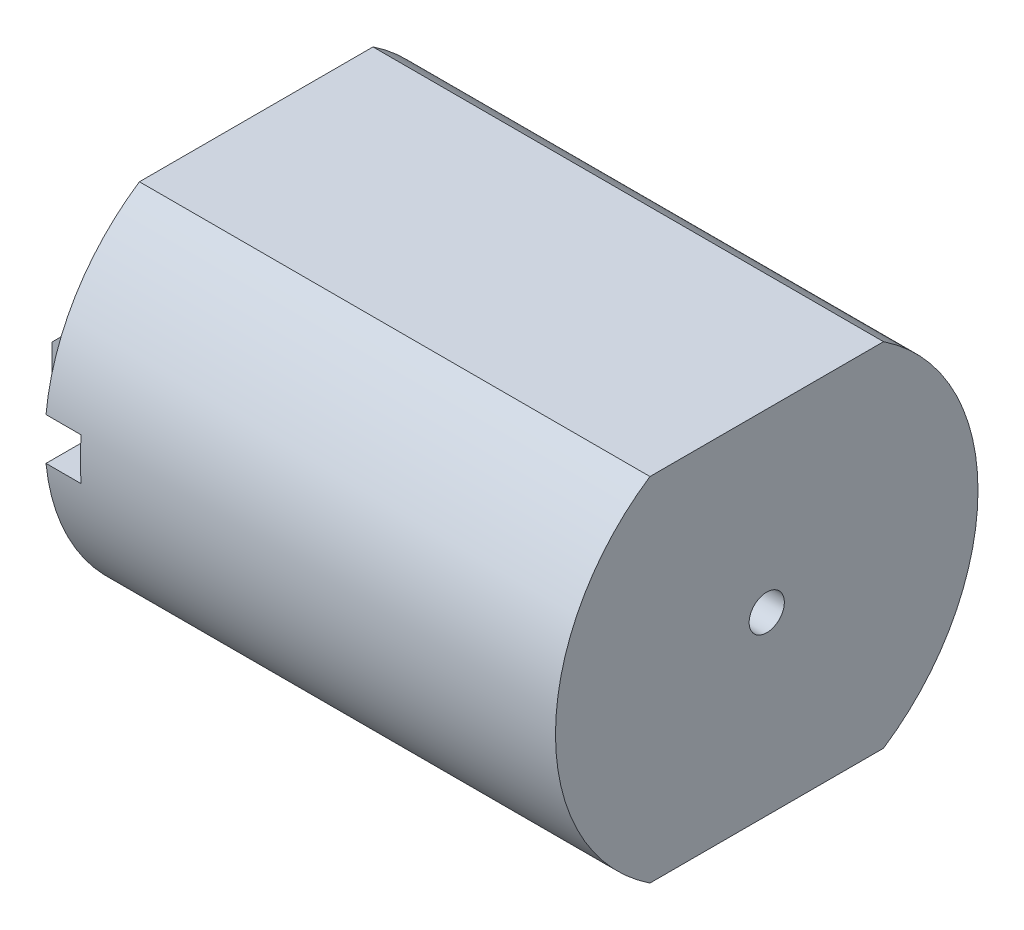
ISO-10303-21;
HEADER;
FILE_DESCRIPTION(('STEP AP214'),'2;1');
FILE_NAME('part.step','',(''),(''),'','','');
FILE_SCHEMA(('AUTOMOTIVE_DESIGN { 1 0 10303 214 1 1 1 1 }'));
ENDSEC;
DATA;
#1=APPLICATION_CONTEXT('core data for automotive mechanical design processes');
#2=APPLICATION_PROTOCOL_DEFINITION('international standard','automotive_design',2000,#1);
#3=PRODUCT_CONTEXT('',#1,'mechanical');
#4=PRODUCT('Part','Part','',(#3));
#5=PRODUCT_RELATED_PRODUCT_CATEGORY('part','',(#4));
#6=PRODUCT_DEFINITION_FORMATION('','',#4);
#7=PRODUCT_DEFINITION_CONTEXT('part definition',#1,'design');
#8=PRODUCT_DEFINITION('design','',#6,#7);
#9=PRODUCT_DEFINITION_SHAPE('','',#8);
#10=(LENGTH_UNIT() NAMED_UNIT(*) SI_UNIT(.MILLI.,.METRE.));
#11=(NAMED_UNIT(*) PLANE_ANGLE_UNIT() SI_UNIT($,.RADIAN.));
#12=(NAMED_UNIT(*) SI_UNIT($,.STERADIAN.) SOLID_ANGLE_UNIT());
#13=UNCERTAINTY_MEASURE_WITH_UNIT(LENGTH_MEASURE(1.E-05),#10,'distance_accuracy_value','');
#14=(GEOMETRIC_REPRESENTATION_CONTEXT(3) GLOBAL_UNCERTAINTY_ASSIGNED_CONTEXT((#13)) GLOBAL_UNIT_ASSIGNED_CONTEXT((#10,
#11,#12)) REPRESENTATION_CONTEXT('',''));
#15=CARTESIAN_POINT('',(0.,0.,0.));
#16=DIRECTION('',(0.,0.,1.));
#17=DIRECTION('',(1.,0.,0.));
#18=AXIS2_PLACEMENT_3D('',#15,#16,#17);
#19=CARTESIAN_POINT('',(-1.,0.,0.));
#20=DIRECTION('',(-1.,0.,0.));
#21=DIRECTION('',(0.,0.,1.));
#22=AXIS2_PLACEMENT_3D('',#19,#20,#21);
#23=PLANE('',#22);
#24=CARTESIAN_POINT('',(-1.,0.,0.));
#25=DIRECTION('',(-1.,0.,0.));
#26=DIRECTION('',(0.,0.,1.));
#27=AXIS2_PLACEMENT_3D('',#24,#25,#26);
#28=CIRCLE('',#27,2.5);
#29=CARTESIAN_POINT('',(-1.,0.,2.5));
#30=VERTEX_POINT('',#29);
#31=EDGE_CURVE('E362',#30,#30,#28,.T.);
#32=ORIENTED_EDGE('',*,*,#31,.F.);
#33=EDGE_LOOP('',(#32));
#34=FACE_BOUND('',#33,.T.);
#35=DIRECTION('',(0.,0.,1.));
#36=VECTOR('',#35,1.);
#37=CARTESIAN_POINT('',(-1.,0.6,-4.96992462263972));
#38=LINE('',#37,#36);
#39=CARTESIAN_POINT('',(-1.,0.600000000000001,-5.96992462263972));
#40=VERTEX_POINT('',#39);
#41=CARTESIAN_POINT('',(-1.,0.6,-4.96992462263972));
#42=VERTEX_POINT('',#41);
#43=EDGE_CURVE('E367',#40,#42,#38,.T.);
#44=ORIENTED_EDGE('',*,*,#43,.T.);
#45=DIRECTION('',(0.,-1.,0.));
#46=VECTOR('',#45,1.);
#47=CARTESIAN_POINT('',(-1.,0.6,-4.96992462263972));
#48=LINE('',#47,#46);
#49=CARTESIAN_POINT('',(-1.,-0.6,-4.96992462263972));
#50=VERTEX_POINT('',#49);
#51=EDGE_CURVE('E371',#42,#50,#48,.T.);
#52=ORIENTED_EDGE('',*,*,#51,.T.);
#53=DIRECTION('',(0.,0.,-1.));
#54=VECTOR('',#53,1.);
#55=CARTESIAN_POINT('',(-1.,-0.6,-4.96992462263972));
#56=LINE('',#55,#54);
#57=CARTESIAN_POINT('',(-1.,-0.6,-5.96992462263972));
#58=VERTEX_POINT('',#57);
#59=EDGE_CURVE('E375',#50,#58,#56,.T.);
#60=ORIENTED_EDGE('',*,*,#59,.T.);
#61=CARTESIAN_POINT('',(-1.,0.,0.));
#62=DIRECTION('',(-1.,0.,0.));
#63=DIRECTION('',(0.,0.,1.));
#64=AXIS2_PLACEMENT_3D('',#61,#62,#63);
#65=CIRCLE('',#64,6.);
#66=CARTESIAN_POINT('',(-1.,-5.,-3.3166247903554));
#67=VERTEX_POINT('',#66);
#68=EDGE_CURVE('E378',#58,#67,#65,.T.);
#69=ORIENTED_EDGE('',*,*,#68,.T.);
#70=DIRECTION('',(0.,0.,1.));
#71=VECTOR('',#70,1.);
#72=CARTESIAN_POINT('',(-1.,-5.,-3.3166247903554));
#73=LINE('',#72,#71);
#74=CARTESIAN_POINT('',(-1.,-5.,3.3166247903554));
#75=VERTEX_POINT('',#74);
#76=EDGE_CURVE('E382',#67,#75,#73,.T.);
#77=ORIENTED_EDGE('',*,*,#76,.T.);
#78=CARTESIAN_POINT('',(-1.,0.,0.));
#79=DIRECTION('',(-1.,0.,0.));
#80=DIRECTION('',(0.,0.,1.));
#81=AXIS2_PLACEMENT_3D('',#78,#79,#80);
#82=CIRCLE('',#81,6.);
#83=CARTESIAN_POINT('',(-1.,-0.600000000000001,5.96992462263972));
#84=VERTEX_POINT('',#83);
#85=EDGE_CURVE('E386',#75,#84,#82,.T.);
#86=ORIENTED_EDGE('',*,*,#85,.T.);
#87=DIRECTION('',(0.,0.,-1.));
#88=VECTOR('',#87,1.);
#89=CARTESIAN_POINT('',(-1.,-0.6,4.96992462263972));
#90=LINE('',#89,#88);
#91=CARTESIAN_POINT('',(-1.,-0.6,4.96992462263972));
#92=VERTEX_POINT('',#91);
#93=EDGE_CURVE('E389',#84,#92,#90,.T.);
#94=ORIENTED_EDGE('',*,*,#93,.T.);
#95=DIRECTION('',(0.,1.,0.));
#96=VECTOR('',#95,1.);
#97=CARTESIAN_POINT('',(-1.,0.6,4.96992462263972));
#98=LINE('',#97,#96);
#99=CARTESIAN_POINT('',(-1.,0.6,4.96992462263972));
#100=VERTEX_POINT('',#99);
#101=EDGE_CURVE('E392',#92,#100,#98,.T.);
#102=ORIENTED_EDGE('',*,*,#101,.T.);
#103=DIRECTION('',(0.,0.,1.));
#104=VECTOR('',#103,1.);
#105=CARTESIAN_POINT('',(-1.,0.6,4.96992462263972));
#106=LINE('',#105,#104);
#107=CARTESIAN_POINT('',(-1.,0.6,5.96992462263972));
#108=VERTEX_POINT('',#107);
#109=EDGE_CURVE('E395',#100,#108,#106,.T.);
#110=ORIENTED_EDGE('',*,*,#109,.T.);
#111=CARTESIAN_POINT('',(-1.,0.,0.));
#112=DIRECTION('',(-1.,0.,0.));
#113=DIRECTION('',(0.,0.,1.));
#114=AXIS2_PLACEMENT_3D('',#111,#112,#113);
#115=CIRCLE('',#114,6.);
#116=CARTESIAN_POINT('',(-1.,5.,3.3166247903554));
#117=VERTEX_POINT('',#116);
#118=EDGE_CURVE('E398',#108,#117,#115,.T.);
#119=ORIENTED_EDGE('',*,*,#118,.T.);
#120=DIRECTION('',(0.,0.,-1.));
#121=VECTOR('',#120,1.);
#122=CARTESIAN_POINT('',(-1.,5.,3.3166247903554));
#123=LINE('',#122,#121);
#124=CARTESIAN_POINT('',(-1.,5.,-3.3166247903554));
#125=VERTEX_POINT('',#124);
#126=EDGE_CURVE('E402',#117,#125,#123,.T.);
#127=ORIENTED_EDGE('',*,*,#126,.T.);
#128=CARTESIAN_POINT('',(-1.,0.,0.));
#129=DIRECTION('',(-1.,0.,0.));
#130=DIRECTION('',(0.,0.,1.));
#131=AXIS2_PLACEMENT_3D('',#128,#129,#130);
#132=CIRCLE('',#131,6.);
#133=EDGE_CURVE('E406',#125,#40,#132,.T.);
#134=ORIENTED_EDGE('',*,*,#133,.T.);
#135=EDGE_LOOP('',(#44,#52,#60,#69,#77,#86,#94,#102,#110,#119,#127,#134));
#136=FACE_BOUND('',#135,.T.);
#137=DIRECTION('',(0.,0.,1.));
#138=VECTOR('',#137,1.);
#139=CARTESIAN_POINT('',(-1.,-0.75,3.75));
#140=LINE('',#139,#138);
#141=CARTESIAN_POINT('',(-1.,-0.75,3.75));
#142=VERTEX_POINT('',#141);
#143=CARTESIAN_POINT('',(-1.,-0.75,4.));
#144=VERTEX_POINT('',#143);
#145=EDGE_CURVE('E336',#142,#144,#140,.T.);
#146=ORIENTED_EDGE('',*,*,#145,.F.);
#147=DIRECTION('',(0.,1.,0.));
#148=VECTOR('',#147,1.);
#149=CARTESIAN_POINT('',(-1.,0.75,3.75));
#150=LINE('',#149,#148);
#151=CARTESIAN_POINT('',(-1.,0.75,3.75));
#152=VERTEX_POINT('',#151);
#153=EDGE_CURVE('E289',#142,#152,#150,.T.);
#154=ORIENTED_EDGE('',*,*,#153,.T.);
#155=DIRECTION('',(0.,0.,1.));
#156=VECTOR('',#155,1.);
#157=CARTESIAN_POINT('',(-1.,0.75,3.75));
#158=LINE('',#157,#156);
#159=CARTESIAN_POINT('',(-1.,0.75,4.));
#160=VERTEX_POINT('',#159);
#161=EDGE_CURVE('E313',#152,#160,#158,.T.);
#162=ORIENTED_EDGE('',*,*,#161,.T.);
#163=DIRECTION('',(0.,1.,0.));
#164=VECTOR('',#163,1.);
#165=CARTESIAN_POINT('',(-1.,0.75,4.));
#166=LINE('',#165,#164);
#167=EDGE_CURVE('E285',#144,#160,#166,.T.);
#168=ORIENTED_EDGE('',*,*,#167,.F.);
#169=EDGE_LOOP('',(#146,#154,#162,#168));
#170=FACE_BOUND('',#169,.T.);
#171=DIRECTION('',(0.,0.,1.));
#172=VECTOR('',#171,1.);
#173=CARTESIAN_POINT('',(-1.,-0.750000000000001,-4.25));
#174=LINE('',#173,#172);
#175=CARTESIAN_POINT('',(-1.,-0.750000000000001,-4.25));
#176=VERTEX_POINT('',#175);
#177=CARTESIAN_POINT('',(-1.,-0.750000000000001,-4.));
#178=VERTEX_POINT('',#177);
#179=EDGE_CURVE('E61',#176,#178,#174,.T.);
#180=ORIENTED_EDGE('',*,*,#179,.F.);
#181=DIRECTION('',(0.,1.,0.));
#182=VECTOR('',#181,1.);
#183=CARTESIAN_POINT('',(-1.,0.749999999999999,-4.25));
#184=LINE('',#183,#182);
#185=CARTESIAN_POINT('',(-1.,0.749999999999999,-4.25));
#186=VERTEX_POINT('',#185);
#187=EDGE_CURVE('E65',#176,#186,#184,.T.);
#188=ORIENTED_EDGE('',*,*,#187,.T.);
#189=DIRECTION('',(0.,0.,1.));
#190=VECTOR('',#189,1.);
#191=CARTESIAN_POINT('',(-1.,0.749999999999999,-4.25));
#192=LINE('',#191,#190);
#193=CARTESIAN_POINT('',(-1.,0.749999999999999,-4.));
#194=VERTEX_POINT('',#193);
#195=EDGE_CURVE('E217',#186,#194,#192,.T.);
#196=ORIENTED_EDGE('',*,*,#195,.T.);
#197=DIRECTION('',(0.,1.,0.));
#198=VECTOR('',#197,1.);
#199=CARTESIAN_POINT('',(-1.,0.749999999999999,-4.));
#200=LINE('',#199,#198);
#201=EDGE_CURVE('E247',#178,#194,#200,.T.);
#202=ORIENTED_EDGE('',*,*,#201,.F.);
#203=EDGE_LOOP('',(#180,#188,#196,#202));
#204=FACE_BOUND('',#203,.T.);
#205=ADVANCED_FACE('F45',(#34,#136,#170,#204),#23,.T.);
#206=CARTESIAN_POINT('',(0.,0.,0.));
#207=DIRECTION('',(1.,0.,0.));
#208=DIRECTION('',(0.,0.,-1.));
#209=AXIS2_PLACEMENT_3D('',#206,#207,#208);
#210=PLANE('',#209);
#211=DIRECTION('',(0.,0.,1.));
#212=VECTOR('',#211,1.);
#213=CARTESIAN_POINT('',(0.,0.6,4.96992462263972));
#214=LINE('',#213,#212);
#215=CARTESIAN_POINT('',(0.,0.6,4.96992462263972));
#216=VERTEX_POINT('',#215);
#217=CARTESIAN_POINT('',(0.,0.6,5.96992462263972));
#218=VERTEX_POINT('',#217);
#219=EDGE_CURVE('E372',#216,#218,#214,.T.);
#220=ORIENTED_EDGE('',*,*,#219,.F.);
#221=DIRECTION('',(0.,1.,0.));
#222=VECTOR('',#221,1.);
#223=CARTESIAN_POINT('',(0.,0.6,4.96992462263972));
#224=LINE('',#223,#222);
#225=CARTESIAN_POINT('',(0.,-0.6,4.96992462263972));
#226=VERTEX_POINT('',#225);
#227=EDGE_CURVE('E425',#226,#216,#224,.T.);
#228=ORIENTED_EDGE('',*,*,#227,.F.);
#229=DIRECTION('',(0.,0.,-1.));
#230=VECTOR('',#229,1.);
#231=CARTESIAN_POINT('',(0.,-0.6,4.96992462263972));
#232=LINE('',#231,#230);
#233=CARTESIAN_POINT('',(0.,-0.6,5.96992462263972));
#234=VERTEX_POINT('',#233);
#235=EDGE_CURVE('E421',#234,#226,#232,.T.);
#236=ORIENTED_EDGE('',*,*,#235,.F.);
#237=CARTESIAN_POINT('',(0.,0.,0.));
#238=DIRECTION('',(1.,0.,0.));
#239=DIRECTION('',(0.,0.,-1.));
#240=AXIS2_PLACEMENT_3D('',#237,#238,#239);
#241=CIRCLE('',#240,6.);
#242=EDGE_CURVE('E469',#218,#234,#241,.T.);
#243=ORIENTED_EDGE('',*,*,#242,.F.);
#244=EDGE_LOOP('',(#220,#228,#236,#243));
#245=FACE_BOUND('',#244,.T.);
#246=ADVANCED_FACE('F519',(#245),#210,.F.);
#247=DIRECTION('',(0.,0.,1.));
#248=VECTOR('',#247,1.);
#249=CARTESIAN_POINT('',(0.,0.6,-4.96992462263972));
#250=LINE('',#249,#248);
#251=CARTESIAN_POINT('',(0.,0.6,-5.96992462263972));
#252=VERTEX_POINT('',#251);
#253=CARTESIAN_POINT('',(0.,0.6,-4.96992462263972));
#254=VERTEX_POINT('',#253);
#255=EDGE_CURVE('E366',#252,#254,#250,.T.);
#256=ORIENTED_EDGE('',*,*,#255,.F.);
#257=CARTESIAN_POINT('',(0.,0.,0.));
#258=DIRECTION('',(1.,0.,0.));
#259=DIRECTION('',(0.,0.,-1.));
#260=AXIS2_PLACEMENT_3D('',#257,#258,#259);
#261=CIRCLE('',#260,6.);
#262=CARTESIAN_POINT('',(0.,-0.6,-5.96992462263972));
#263=VERTEX_POINT('',#262);
#264=EDGE_CURVE('E463',#263,#252,#261,.T.);
#265=ORIENTED_EDGE('',*,*,#264,.F.);
#266=DIRECTION('',(0.,0.,-1.));
#267=VECTOR('',#266,1.);
#268=CARTESIAN_POINT('',(0.,-0.6,-4.96992462263972));
#269=LINE('',#268,#267);
#270=CARTESIAN_POINT('',(0.,-0.6,-4.96992462263972));
#271=VERTEX_POINT('',#270);
#272=EDGE_CURVE('E417',#271,#263,#269,.T.);
#273=ORIENTED_EDGE('',*,*,#272,.F.);
#274=DIRECTION('',(0.,-1.,0.));
#275=VECTOR('',#274,1.);
#276=CARTESIAN_POINT('',(0.,0.6,-4.96992462263972));
#277=LINE('',#276,#275);
#278=EDGE_CURVE('E413',#254,#271,#277,.T.);
#279=ORIENTED_EDGE('',*,*,#278,.F.);
#280=EDGE_LOOP('',(#256,#265,#273,#279));
#281=FACE_BOUND('',#280,.T.);
#282=ADVANCED_FACE('F526',(#281),#210,.F.);
#283=CARTESIAN_POINT('',(13.5,0.,0.));
#284=DIRECTION('',(-1.,0.,0.));
#285=DIRECTION('',(0.,0.,1.));
#286=AXIS2_PLACEMENT_3D('',#283,#284,#285);
#287=CYLINDRICAL_SURFACE('',#286,6.);
#288=DIRECTION('',(-1.,0.,0.));
#289=VECTOR('',#288,1.);
#290=CARTESIAN_POINT('',(13.5,-5.,-3.3166247903554));
#291=LINE('',#290,#289);
#292=CARTESIAN_POINT('',(13.5,-5.,-3.3166247903554));
#293=VERTEX_POINT('',#292);
#294=EDGE_CURVE('E478',#293,#67,#291,.T.);
#295=ORIENTED_EDGE('',*,*,#294,.T.);
#296=ORIENTED_EDGE('',*,*,#68,.F.);
#297=DIRECTION('',(1.,0.,0.));
#298=VECTOR('',#297,1.);
#299=CARTESIAN_POINT('',(-1.,-0.6,-5.96992462263972));
#300=LINE('',#299,#298);
#301=EDGE_CURVE('E451',#58,#263,#300,.T.);
#302=ORIENTED_EDGE('',*,*,#301,.T.);
#303=ORIENTED_EDGE('',*,*,#264,.T.);
#304=DIRECTION('',(1.,0.,0.));
#305=VECTOR('',#304,1.);
#306=CARTESIAN_POINT('',(-1.,0.600000000000001,-5.96992462263972));
#307=LINE('',#306,#305);
#308=EDGE_CURVE('E409',#40,#252,#307,.T.);
#309=ORIENTED_EDGE('',*,*,#308,.F.);
#310=ORIENTED_EDGE('',*,*,#133,.F.);
#311=DIRECTION('',(-1.,0.,0.));
#312=VECTOR('',#311,1.);
#313=CARTESIAN_POINT('',(13.5,5.,-3.3166247903554));
#314=LINE('',#313,#312);
#315=CARTESIAN_POINT('',(13.5,5.,-3.3166247903554));
#316=VERTEX_POINT('',#315);
#317=EDGE_CURVE('E493',#316,#125,#314,.T.);
#318=ORIENTED_EDGE('',*,*,#317,.F.);
#319=CARTESIAN_POINT('',(13.5,0.,0.));
#320=DIRECTION('',(1.,0.,0.));
#321=DIRECTION('',(0.,0.,-1.));
#322=AXIS2_PLACEMENT_3D('',#319,#320,#321);
#323=CIRCLE('',#322,6.);
#324=EDGE_CURVE('E464',#293,#316,#323,.T.);
#325=ORIENTED_EDGE('',*,*,#324,.F.);
#326=EDGE_LOOP('',(#295,#296,#302,#303,#309,#310,#318,#325));
#327=FACE_BOUND('',#326,.T.);
#328=ADVANCED_FACE('F572',(#327),#287,.T.);
#329=CARTESIAN_POINT('',(13.5,5.,3.3166247903554));
#330=DIRECTION('',(0.,-1.,0.));
#331=DIRECTION('',(0.,0.,-1.));
#332=AXIS2_PLACEMENT_3D('',#329,#330,#331);
#333=PLANE('',#332);
#334=ORIENTED_EDGE('',*,*,#317,.T.);
#335=ORIENTED_EDGE('',*,*,#126,.F.);
#336=DIRECTION('',(-1.,0.,0.));
#337=VECTOR('',#336,1.);
#338=CARTESIAN_POINT('',(13.5,5.,3.3166247903554));
#339=LINE('',#338,#337);
#340=CARTESIAN_POINT('',(13.5,5.,3.3166247903554));
#341=VERTEX_POINT('',#340);
#342=EDGE_CURVE('E490',#341,#117,#339,.T.);
#343=ORIENTED_EDGE('',*,*,#342,.F.);
#344=DIRECTION('',(0.,0.,1.));
#345=VECTOR('',#344,1.);
#346=CARTESIAN_POINT('',(13.5,5.,3.3166247903554));
#347=LINE('',#346,#345);
#348=EDGE_CURVE('E468',#316,#341,#347,.T.);
#349=ORIENTED_EDGE('',*,*,#348,.F.);
#350=EDGE_LOOP('',(#334,#335,#343,#349));
#351=FACE_BOUND('',#350,.T.);
#352=ADVANCED_FACE('F569',(#351),#333,.F.);
#353=CARTESIAN_POINT('',(13.5,0.,0.));
#354=DIRECTION('',(-1.,0.,0.));
#355=DIRECTION('',(0.,0.,1.));
#356=AXIS2_PLACEMENT_3D('',#353,#354,#355);
#357=CYLINDRICAL_SURFACE('',#356,6.);
#358=ORIENTED_EDGE('',*,*,#342,.T.);
#359=ORIENTED_EDGE('',*,*,#118,.F.);
#360=DIRECTION('',(1.,0.,0.));
#361=VECTOR('',#360,1.);
#362=CARTESIAN_POINT('',(-1.,0.6,5.96992462263972));
#363=LINE('',#362,#361);
#364=EDGE_CURVE('E435',#108,#218,#363,.T.);
#365=ORIENTED_EDGE('',*,*,#364,.T.);
#366=ORIENTED_EDGE('',*,*,#242,.T.);
#367=DIRECTION('',(1.,0.,0.));
#368=VECTOR('',#367,1.);
#369=CARTESIAN_POINT('',(-1.,-0.600000000000001,5.96992462263972));
#370=LINE('',#369,#368);
#371=EDGE_CURVE('E447',#84,#234,#370,.T.);
#372=ORIENTED_EDGE('',*,*,#371,.F.);
#373=ORIENTED_EDGE('',*,*,#85,.F.);
#374=DIRECTION('',(-1.,0.,0.));
#375=VECTOR('',#374,1.);
#376=CARTESIAN_POINT('',(13.5,-5.,3.3166247903554));
#377=LINE('',#376,#375);
#378=CARTESIAN_POINT('',(13.5,-5.,3.3166247903554));
#379=VERTEX_POINT('',#378);
#380=EDGE_CURVE('E487',#379,#75,#377,.T.);
#381=ORIENTED_EDGE('',*,*,#380,.F.);
#382=CARTESIAN_POINT('',(13.5,0.,0.));
#383=DIRECTION('',(1.,0.,0.));
#384=DIRECTION('',(0.,0.,-1.));
#385=AXIS2_PLACEMENT_3D('',#382,#383,#384);
#386=CIRCLE('',#385,6.);
#387=EDGE_CURVE('E472',#341,#379,#386,.T.);
#388=ORIENTED_EDGE('',*,*,#387,.F.);
#389=EDGE_LOOP('',(#358,#359,#365,#366,#372,#373,#381,#388));
#390=FACE_BOUND('',#389,.T.);
#391=ADVANCED_FACE('F565',(#390),#357,.T.);
#392=CARTESIAN_POINT('',(13.5,-5.,3.3166247903554));
#393=DIRECTION('',(0.,1.,0.));
#394=DIRECTION('',(0.,0.,1.));
#395=AXIS2_PLACEMENT_3D('',#392,#393,#394);
#396=PLANE('',#395);
#397=ORIENTED_EDGE('',*,*,#380,.T.);
#398=ORIENTED_EDGE('',*,*,#76,.F.);
#399=ORIENTED_EDGE('',*,*,#294,.F.);
#400=DIRECTION('',(0.,0.,-1.));
#401=VECTOR('',#400,1.);
#402=CARTESIAN_POINT('',(13.5,-5.,3.3166247903554));
#403=LINE('',#402,#401);
#404=EDGE_CURVE('E475',#379,#293,#403,.T.);
#405=ORIENTED_EDGE('',*,*,#404,.F.);
#406=EDGE_LOOP('',(#397,#398,#399,#405));
#407=FACE_BOUND('',#406,.T.);
#408=ADVANCED_FACE('F560',(#407),#396,.F.);
#409=CARTESIAN_POINT('',(13.5,0.,0.));
#410=DIRECTION('',(1.,0.,0.));
#411=DIRECTION('',(0.,0.,-1.));
#412=AXIS2_PLACEMENT_3D('',#409,#410,#411);
#413=PLANE('',#412);
#414=CARTESIAN_POINT('',(13.5,0.,0.));
#415=DIRECTION('',(1.,0.,0.));
#416=DIRECTION('',(0.,0.,-1.));
#417=AXIS2_PLACEMENT_3D('',#414,#415,#416);
#418=CIRCLE('',#417,0.5);
#419=CARTESIAN_POINT('',(13.5,0.,-0.5));
#420=VERTEX_POINT('',#419);
#421=EDGE_CURVE('E340',#420,#420,#418,.F.);
#422=ORIENTED_EDGE('',*,*,#421,.T.);
#423=EDGE_LOOP('',(#422));
#424=FACE_BOUND('',#423,.T.);
#425=ORIENTED_EDGE('',*,*,#324,.T.);
#426=ORIENTED_EDGE('',*,*,#348,.T.);
#427=ORIENTED_EDGE('',*,*,#387,.T.);
#428=ORIENTED_EDGE('',*,*,#404,.T.);
#429=EDGE_LOOP('',(#425,#426,#427,#428));
#430=FACE_BOUND('',#429,.T.);
#431=ADVANCED_FACE('F557',(#424,#430),#413,.T.);
#432=CARTESIAN_POINT('',(-1.,0.6,-4.96992462263972));
#433=DIRECTION('',(0.,1.,0.));
#434=DIRECTION('',(0.,0.,1.));
#435=AXIS2_PLACEMENT_3D('',#432,#433,#434);
#436=PLANE('',#435);
#437=ORIENTED_EDGE('',*,*,#255,.T.);
#438=DIRECTION('',(1.,0.,0.));
#439=VECTOR('',#438,1.);
#440=CARTESIAN_POINT('',(-1.,0.6,-4.96992462263972));
#441=LINE('',#440,#439);
#442=EDGE_CURVE('E459',#42,#254,#441,.T.);
#443=ORIENTED_EDGE('',*,*,#442,.F.);
#444=ORIENTED_EDGE('',*,*,#43,.F.);
#445=ORIENTED_EDGE('',*,*,#308,.T.);
#446=EDGE_LOOP('',(#437,#443,#444,#445));
#447=FACE_BOUND('',#446,.T.);
#448=ADVANCED_FACE('F553',(#447),#436,.F.);
#449=CARTESIAN_POINT('',(-1.,0.6,-4.96992462263972));
#450=DIRECTION('',(0.,0.,1.));
#451=DIRECTION('',(1.,0.,0.));
#452=AXIS2_PLACEMENT_3D('',#449,#450,#451);
#453=PLANE('',#452);
#454=ORIENTED_EDGE('',*,*,#278,.T.);
#455=DIRECTION('',(1.,0.,0.));
#456=VECTOR('',#455,1.);
#457=CARTESIAN_POINT('',(-1.,-0.6,-4.96992462263972));
#458=LINE('',#457,#456);
#459=EDGE_CURVE('E455',#50,#271,#458,.T.);
#460=ORIENTED_EDGE('',*,*,#459,.F.);
#461=ORIENTED_EDGE('',*,*,#51,.F.);
#462=ORIENTED_EDGE('',*,*,#442,.T.);
#463=EDGE_LOOP('',(#454,#460,#461,#462));
#464=FACE_BOUND('',#463,.T.);
#465=ADVANCED_FACE('F549',(#464),#453,.F.);
#466=CARTESIAN_POINT('',(-1.,-0.6,-4.96992462263972));
#467=DIRECTION('',(0.,-1.,0.));
#468=DIRECTION('',(0.,0.,-1.));
#469=AXIS2_PLACEMENT_3D('',#466,#467,#468);
#470=PLANE('',#469);
#471=ORIENTED_EDGE('',*,*,#272,.T.);
#472=ORIENTED_EDGE('',*,*,#301,.F.);
#473=ORIENTED_EDGE('',*,*,#59,.F.);
#474=ORIENTED_EDGE('',*,*,#459,.T.);
#475=EDGE_LOOP('',(#471,#472,#473,#474));
#476=FACE_BOUND('',#475,.T.);
#477=ADVANCED_FACE('F545',(#476),#470,.F.);
#478=CARTESIAN_POINT('',(-1.,-0.6,4.96992462263972));
#479=DIRECTION('',(0.,-1.,0.));
#480=DIRECTION('',(0.,0.,-1.));
#481=AXIS2_PLACEMENT_3D('',#478,#479,#480);
#482=PLANE('',#481);
#483=ORIENTED_EDGE('',*,*,#235,.T.);
#484=DIRECTION('',(1.,0.,0.));
#485=VECTOR('',#484,1.);
#486=CARTESIAN_POINT('',(-1.,-0.6,4.96992462263972));
#487=LINE('',#486,#485);
#488=EDGE_CURVE('E443',#92,#226,#487,.T.);
#489=ORIENTED_EDGE('',*,*,#488,.F.);
#490=ORIENTED_EDGE('',*,*,#93,.F.);
#491=ORIENTED_EDGE('',*,*,#371,.T.);
#492=EDGE_LOOP('',(#483,#489,#490,#491));
#493=FACE_BOUND('',#492,.T.);
#494=ADVANCED_FACE('F541',(#493),#482,.F.);
#495=CARTESIAN_POINT('',(-1.,0.6,4.96992462263972));
#496=DIRECTION('',(0.,0.,-1.));
#497=DIRECTION('',(-1.,0.,0.));
#498=AXIS2_PLACEMENT_3D('',#495,#496,#497);
#499=PLANE('',#498);
#500=ORIENTED_EDGE('',*,*,#227,.T.);
#501=DIRECTION('',(1.,0.,0.));
#502=VECTOR('',#501,1.);
#503=CARTESIAN_POINT('',(-1.,0.6,4.96992462263972));
#504=LINE('',#503,#502);
#505=EDGE_CURVE('E439',#100,#216,#504,.T.);
#506=ORIENTED_EDGE('',*,*,#505,.F.);
#507=ORIENTED_EDGE('',*,*,#101,.F.);
#508=ORIENTED_EDGE('',*,*,#488,.T.);
#509=EDGE_LOOP('',(#500,#506,#507,#508));
#510=FACE_BOUND('',#509,.T.);
#511=ADVANCED_FACE('F537',(#510),#499,.F.);
#512=CARTESIAN_POINT('',(-1.,0.6,4.96992462263972));
#513=DIRECTION('',(0.,1.,0.));
#514=DIRECTION('',(0.,0.,1.));
#515=AXIS2_PLACEMENT_3D('',#512,#513,#514);
#516=PLANE('',#515);
#517=ORIENTED_EDGE('',*,*,#219,.T.);
#518=ORIENTED_EDGE('',*,*,#364,.F.);
#519=ORIENTED_EDGE('',*,*,#109,.F.);
#520=ORIENTED_EDGE('',*,*,#505,.T.);
#521=EDGE_LOOP('',(#517,#518,#519,#520));
#522=FACE_BOUND('',#521,.T.);
#523=ADVANCED_FACE('F534',(#522),#516,.F.);
#524=CARTESIAN_POINT('',(-2.,0.,0.));
#525=DIRECTION('',(-1.,0.,0.));
#526=DIRECTION('',(0.,0.,1.));
#527=AXIS2_PLACEMENT_3D('',#524,#525,#526);
#528=PLANE('',#527);
#529=CARTESIAN_POINT('',(-2.,0.,0.));
#530=DIRECTION('',(-1.,0.,0.));
#531=DIRECTION('',(0.,0.,1.));
#532=AXIS2_PLACEMENT_3D('',#529,#530,#531);
#533=CIRCLE('',#532,2.25);
#534=CARTESIAN_POINT('',(-2.,0.,2.25));
#535=VERTEX_POINT('',#534);
#536=EDGE_CURVE('E54',#535,#535,#533,.T.);
#537=ORIENTED_EDGE('',*,*,#536,.T.);
#538=EDGE_LOOP('',(#537));
#539=FACE_BOUND('',#538,.T.);
#540=CARTESIAN_POINT('',(-2.,0.,0.));
#541=DIRECTION('',(-1.,0.,0.));
#542=DIRECTION('',(0.,0.,1.));
#543=AXIS2_PLACEMENT_3D('',#540,#541,#542);
#544=CIRCLE('',#543,0.5);
#545=CARTESIAN_POINT('',(-2.,0.,0.5));
#546=VERTEX_POINT('',#545);
#547=EDGE_CURVE('E358',#546,#546,#544,.T.);
#548=ORIENTED_EDGE('',*,*,#547,.F.);
#549=EDGE_LOOP('',(#548));
#550=FACE_BOUND('',#549,.T.);
#551=ADVANCED_FACE('F499',(#539,#550),#528,.T.);
#552=CARTESIAN_POINT('',(-2.,0.,0.));
#553=DIRECTION('',(1.,0.,0.));
#554=DIRECTION('',(0.,0.,-1.));
#555=AXIS2_PLACEMENT_3D('',#552,#553,#554);
#556=CYLINDRICAL_SURFACE('',#555,2.5);
#557=CARTESIAN_POINT('',(-1.75,0.,0.));
#558=DIRECTION('',(-1.,0.,0.));
#559=DIRECTION('',(0.,0.,1.));
#560=AXIS2_PLACEMENT_3D('',#557,#558,#559);
#561=CIRCLE('',#560,2.5);
#562=CARTESIAN_POINT('',(-1.75,0.,2.5));
#563=VERTEX_POINT('',#562);
#564=EDGE_CURVE('E11',#563,#563,#561,.F.);
#565=ORIENTED_EDGE('',*,*,#564,.T.);
#566=EDGE_LOOP('',(#565));
#567=FACE_BOUND('',#566,.T.);
#568=ORIENTED_EDGE('',*,*,#31,.T.);
#569=EDGE_LOOP('',(#568));
#570=FACE_BOUND('',#569,.T.);
#571=ADVANCED_FACE('F514',(#567,#570),#556,.T.);
#572=CARTESIAN_POINT('',(-2.,0.,0.));
#573=DIRECTION('',(1.,0.,0.));
#574=DIRECTION('',(0.,0.,-1.));
#575=AXIS2_PLACEMENT_3D('',#572,#573,#574);
#576=CYLINDRICAL_SURFACE('',#575,0.5);
#577=ORIENTED_EDGE('',*,*,#547,.T.);
#578=EDGE_LOOP('',(#577));
#579=FACE_BOUND('',#578,.T.);
#580=ORIENTED_EDGE('',*,*,#421,.F.);
#581=EDGE_LOOP('',(#580));
#582=FACE_BOUND('',#581,.T.);
#583=ADVANCED_FACE('F504',(#579,#582),#576,.F.);
#584=CARTESIAN_POINT('',(-1.75,0.,0.));
#585=DIRECTION('',(-1.,0.,0.));
#586=DIRECTION('',(0.,0.,1.));
#587=AXIS2_PLACEMENT_3D('',#584,#585,#586);
#588=TOROIDAL_SURFACE('',#587,2.25,0.25);
#589=ORIENTED_EDGE('',*,*,#564,.F.);
#590=EDGE_LOOP('',(#589));
#591=FACE_BOUND('',#590,.T.);
#592=ORIENTED_EDGE('',*,*,#536,.F.);
#593=EDGE_LOOP('',(#592));
#594=FACE_BOUND('',#593,.T.);
#595=ADVANCED_FACE('F47',(#591,#594),#588,.T.);
#596=CARTESIAN_POINT('',(-2.55,-0.75,3.75));
#597=DIRECTION('',(0.,-1.,0.));
#598=DIRECTION('',(0.,0.,-1.));
#599=AXIS2_PLACEMENT_3D('',#596,#597,#598);
#600=PLANE('',#599);
#601=DIRECTION('',(1.,0.,0.));
#602=VECTOR('',#601,1.);
#603=CARTESIAN_POINT('',(-2.55,-0.75,4.));
#604=LINE('',#603,#602);
#605=CARTESIAN_POINT('',(-2.55,-0.75,4.));
#606=VERTEX_POINT('',#605);
#607=EDGE_CURVE('E293',#606,#144,#604,.T.);
#608=ORIENTED_EDGE('',*,*,#607,.F.);
#609=DIRECTION('',(0.,0.,1.));
#610=VECTOR('',#609,1.);
#611=CARTESIAN_POINT('',(-2.55,-0.75,3.75));
#612=LINE('',#611,#610);
#613=CARTESIAN_POINT('',(-2.55,-0.75,3.75));
#614=VERTEX_POINT('',#613);
#615=EDGE_CURVE('E341',#614,#606,#612,.T.);
#616=ORIENTED_EDGE('',*,*,#615,.F.);
#617=DIRECTION('',(1.,0.,0.));
#618=VECTOR('',#617,1.);
#619=CARTESIAN_POINT('',(-2.55,-0.75,3.75));
#620=LINE('',#619,#618);
#621=EDGE_CURVE('E309',#614,#142,#620,.T.);
#622=ORIENTED_EDGE('',*,*,#621,.T.);
#623=ORIENTED_EDGE('',*,*,#145,.T.);
#624=EDGE_LOOP('',(#608,#616,#622,#623));
#625=FACE_BOUND('',#624,.T.);
#626=ADVANCED_FACE('F503',(#625),#600,.T.);
#627=CARTESIAN_POINT('',(-2.8,-0.5,3.75));
#628=DIRECTION('',(-0.707106781186548,-0.707106781186547,0.));
#629=DIRECTION('',(0.707106781186547,-0.707106781186548,0.));
#630=AXIS2_PLACEMENT_3D('',#627,#628,#629);
#631=PLANE('',#630);
#632=DIRECTION('',(0.707106781186547,-0.707106781186548,0.));
#633=VECTOR('',#632,1.);
#634=CARTESIAN_POINT('',(-2.8,-0.5,4.));
#635=LINE('',#634,#633);
#636=CARTESIAN_POINT('',(-2.8,-0.5,4.));
#637=VERTEX_POINT('',#636);
#638=EDGE_CURVE('E329',#637,#606,#635,.T.);
#639=ORIENTED_EDGE('',*,*,#638,.F.);
#640=DIRECTION('',(0.,0.,1.));
#641=VECTOR('',#640,1.);
#642=CARTESIAN_POINT('',(-2.8,-0.5,3.75));
#643=LINE('',#642,#641);
#644=CARTESIAN_POINT('',(-2.8,-0.5,3.75));
#645=VERTEX_POINT('',#644);
#646=EDGE_CURVE('E344',#645,#637,#643,.T.);
#647=ORIENTED_EDGE('',*,*,#646,.F.);
#648=DIRECTION('',(0.707106781186547,-0.707106781186548,0.));
#649=VECTOR('',#648,1.);
#650=CARTESIAN_POINT('',(-2.8,-0.5,3.75));
#651=LINE('',#650,#649);
#652=EDGE_CURVE('E305',#645,#614,#651,.T.);
#653=ORIENTED_EDGE('',*,*,#652,.T.);
#654=ORIENTED_EDGE('',*,*,#615,.T.);
#655=EDGE_LOOP('',(#639,#647,#653,#654));
#656=FACE_BOUND('',#655,.T.);
#657=ADVANCED_FACE('F511',(#656),#631,.T.);
#658=CARTESIAN_POINT('',(-2.8,0.5,3.75));
#659=DIRECTION('',(-1.,0.,0.));
#660=DIRECTION('',(0.,0.,1.));
#661=AXIS2_PLACEMENT_3D('',#658,#659,#660);
#662=PLANE('',#661);
#663=DIRECTION('',(0.,-1.,0.));
#664=VECTOR('',#663,1.);
#665=CARTESIAN_POINT('',(-2.8,0.5,4.));
#666=LINE('',#665,#664);
#667=CARTESIAN_POINT('',(-2.8,0.5,4.));
#668=VERTEX_POINT('',#667);
#669=EDGE_CURVE('E325',#668,#637,#666,.T.);
#670=ORIENTED_EDGE('',*,*,#669,.F.);
#671=DIRECTION('',(0.,0.,1.));
#672=VECTOR('',#671,1.);
#673=CARTESIAN_POINT('',(-2.8,0.5,3.75));
#674=LINE('',#673,#672);
#675=CARTESIAN_POINT('',(-2.8,0.5,3.75));
#676=VERTEX_POINT('',#675);
#677=EDGE_CURVE('E347',#676,#668,#674,.T.);
#678=ORIENTED_EDGE('',*,*,#677,.F.);
#679=DIRECTION('',(0.,-1.,0.));
#680=VECTOR('',#679,1.);
#681=CARTESIAN_POINT('',(-2.8,0.5,3.75));
#682=LINE('',#681,#680);
#683=EDGE_CURVE('E301',#676,#645,#682,.T.);
#684=ORIENTED_EDGE('',*,*,#683,.T.);
#685=ORIENTED_EDGE('',*,*,#646,.T.);
#686=EDGE_LOOP('',(#670,#678,#684,#685));
#687=FACE_BOUND('',#686,.T.);
#688=ADVANCED_FACE('F622',(#687),#662,.T.);
#689=CARTESIAN_POINT('',(-2.8,0.5,3.75));
#690=DIRECTION('',(-0.707106781186548,0.707106781186547,0.));
#691=DIRECTION('',(-0.707106781186547,-0.707106781186548,0.));
#692=AXIS2_PLACEMENT_3D('',#689,#690,#691);
#693=PLANE('',#692);
#694=DIRECTION('',(-0.707106781186547,-0.707106781186548,0.));
#695=VECTOR('',#694,1.);
#696=CARTESIAN_POINT('',(-2.8,0.5,4.));
#697=LINE('',#696,#695);
#698=CARTESIAN_POINT('',(-2.55,0.75,4.));
#699=VERTEX_POINT('',#698);
#700=EDGE_CURVE('E321',#699,#668,#697,.T.);
#701=ORIENTED_EDGE('',*,*,#700,.F.);
#702=DIRECTION('',(0.,0.,1.));
#703=VECTOR('',#702,1.);
#704=CARTESIAN_POINT('',(-2.55,0.75,3.75));
#705=LINE('',#704,#703);
#706=CARTESIAN_POINT('',(-2.55,0.75,3.75));
#707=VERTEX_POINT('',#706);
#708=EDGE_CURVE('E350',#707,#699,#705,.T.);
#709=ORIENTED_EDGE('',*,*,#708,.F.);
#710=DIRECTION('',(-0.707106781186547,-0.707106781186548,0.));
#711=VECTOR('',#710,1.);
#712=CARTESIAN_POINT('',(-2.8,0.5,3.75));
#713=LINE('',#712,#711);
#714=EDGE_CURVE('E297',#707,#676,#713,.T.);
#715=ORIENTED_EDGE('',*,*,#714,.T.);
#716=ORIENTED_EDGE('',*,*,#677,.T.);
#717=EDGE_LOOP('',(#701,#709,#715,#716));
#718=FACE_BOUND('',#717,.T.);
#719=ADVANCED_FACE('F625',(#718),#693,.T.);
#720=CARTESIAN_POINT('',(-2.55,0.75,3.75));
#721=DIRECTION('',(0.,1.,0.));
#722=DIRECTION('',(0.,0.,1.));
#723=AXIS2_PLACEMENT_3D('',#720,#721,#722);
#724=PLANE('',#723);
#725=DIRECTION('',(-1.,0.,0.));
#726=VECTOR('',#725,1.);
#727=CARTESIAN_POINT('',(-2.55,0.75,4.));
#728=LINE('',#727,#726);
#729=EDGE_CURVE('E317',#160,#699,#728,.T.);
#730=ORIENTED_EDGE('',*,*,#729,.F.);
#731=ORIENTED_EDGE('',*,*,#161,.F.);
#732=DIRECTION('',(-1.,0.,0.));
#733=VECTOR('',#732,1.);
#734=CARTESIAN_POINT('',(-2.55,0.75,3.75));
#735=LINE('',#734,#733);
#736=EDGE_CURVE('E292',#152,#707,#735,.T.);
#737=ORIENTED_EDGE('',*,*,#736,.T.);
#738=ORIENTED_EDGE('',*,*,#708,.T.);
#739=EDGE_LOOP('',(#730,#731,#737,#738));
#740=FACE_BOUND('',#739,.T.);
#741=ADVANCED_FACE('F628',(#740),#724,.T.);
#742=CARTESIAN_POINT('',(0.,0.,3.75));
#743=DIRECTION('',(0.,0.,1.));
#744=DIRECTION('',(1.,0.,0.));
#745=AXIS2_PLACEMENT_3D('',#742,#743,#744);
#746=PLANE('',#745);
#747=CARTESIAN_POINT('',(-2.15,0.,3.75));
#748=DIRECTION('',(0.,0.,1.));
#749=DIRECTION('',(1.,0.,0.));
#750=AXIS2_PLACEMENT_3D('',#747,#748,#749);
#751=CIRCLE('',#750,0.5);
#752=CARTESIAN_POINT('',(-1.65,0.,3.75));
#753=VERTEX_POINT('',#752);
#754=EDGE_CURVE('E281',#753,#753,#751,.T.);
#755=ORIENTED_EDGE('',*,*,#754,.T.);
#756=EDGE_LOOP('',(#755));
#757=FACE_BOUND('',#756,.T.);
#758=ORIENTED_EDGE('',*,*,#153,.F.);
#759=ORIENTED_EDGE('',*,*,#621,.F.);
#760=ORIENTED_EDGE('',*,*,#652,.F.);
#761=ORIENTED_EDGE('',*,*,#683,.F.);
#762=ORIENTED_EDGE('',*,*,#714,.F.);
#763=ORIENTED_EDGE('',*,*,#736,.F.);
#764=EDGE_LOOP('',(#758,#759,#760,#761,#762,#763));
#765=FACE_BOUND('',#764,.T.);
#766=ADVANCED_FACE('F614',(#757,#765),#746,.F.);
#767=CARTESIAN_POINT('',(0.,0.,4.));
#768=DIRECTION('',(0.,0.,1.));
#769=DIRECTION('',(1.,0.,0.));
#770=AXIS2_PLACEMENT_3D('',#767,#768,#769);
#771=PLANE('',#770);
#772=CARTESIAN_POINT('',(-2.15,0.,4.));
#773=DIRECTION('',(0.,0.,1.));
#774=DIRECTION('',(1.,0.,0.));
#775=AXIS2_PLACEMENT_3D('',#772,#773,#774);
#776=CIRCLE('',#775,0.5);
#777=CARTESIAN_POINT('',(-1.65,0.,4.));
#778=VERTEX_POINT('',#777);
#779=EDGE_CURVE('E270',#778,#778,#776,.T.);
#780=ORIENTED_EDGE('',*,*,#779,.F.);
#781=EDGE_LOOP('',(#780));
#782=FACE_BOUND('',#781,.T.);
#783=ORIENTED_EDGE('',*,*,#167,.T.);
#784=ORIENTED_EDGE('',*,*,#729,.T.);
#785=ORIENTED_EDGE('',*,*,#700,.T.);
#786=ORIENTED_EDGE('',*,*,#669,.T.);
#787=ORIENTED_EDGE('',*,*,#638,.T.);
#788=ORIENTED_EDGE('',*,*,#607,.T.);
#789=EDGE_LOOP('',(#783,#784,#785,#786,#787,#788));
#790=FACE_BOUND('',#789,.T.);
#791=ADVANCED_FACE('F630',(#782,#790),#771,.T.);
#792=CARTESIAN_POINT('',(-2.15,0.,3.75));
#793=DIRECTION('',(0.,0.,1.));
#794=DIRECTION('',(1.,0.,0.));
#795=AXIS2_PLACEMENT_3D('',#792,#793,#794);
#796=CYLINDRICAL_SURFACE('',#795,0.5);
#797=ORIENTED_EDGE('',*,*,#754,.F.);
#798=EDGE_LOOP('',(#797));
#799=FACE_BOUND('',#798,.T.);
#800=ORIENTED_EDGE('',*,*,#779,.T.);
#801=EDGE_LOOP('',(#800));
#802=FACE_BOUND('',#801,.T.);
#803=ADVANCED_FACE('F632',(#799,#802),#796,.F.);
#804=CARTESIAN_POINT('',(-2.55,-0.750000000000001,-4.25));
#805=DIRECTION('',(0.,-1.,0.));
#806=DIRECTION('',(0.,0.,-1.));
#807=AXIS2_PLACEMENT_3D('',#804,#805,#806);
#808=PLANE('',#807);
#809=DIRECTION('',(1.,0.,0.));
#810=VECTOR('',#809,1.);
#811=CARTESIAN_POINT('',(-2.55,-0.750000000000001,-4.));
#812=LINE('',#811,#810);
#813=CARTESIAN_POINT('',(-2.55,-0.750000000000001,-4.));
#814=VERTEX_POINT('',#813);
#815=EDGE_CURVE('E233',#814,#178,#812,.T.);
#816=ORIENTED_EDGE('',*,*,#815,.F.);
#817=DIRECTION('',(0.,0.,1.));
#818=VECTOR('',#817,1.);
#819=CARTESIAN_POINT('',(-2.55,-0.750000000000001,-4.25));
#820=LINE('',#819,#818);
#821=CARTESIAN_POINT('',(-2.55,-0.750000000000001,-4.25));
#822=VERTEX_POINT('',#821);
#823=EDGE_CURVE('E271',#822,#814,#820,.T.);
#824=ORIENTED_EDGE('',*,*,#823,.F.);
#825=DIRECTION('',(1.,0.,0.));
#826=VECTOR('',#825,1.);
#827=CARTESIAN_POINT('',(-2.55,-0.750000000000001,-4.25));
#828=LINE('',#827,#826);
#829=EDGE_CURVE('E243',#822,#176,#828,.T.);
#830=ORIENTED_EDGE('',*,*,#829,.T.);
#831=ORIENTED_EDGE('',*,*,#179,.T.);
#832=EDGE_LOOP('',(#816,#824,#830,#831));
#833=FACE_BOUND('',#832,.T.);
#834=ADVANCED_FACE('F639',(#833),#808,.T.);
#835=CARTESIAN_POINT('',(-2.8,-0.500000000000001,-4.25));
#836=DIRECTION('',(-0.707106781186548,-0.707106781186547,0.));
#837=DIRECTION('',(0.707106781186547,-0.707106781186548,0.));
#838=AXIS2_PLACEMENT_3D('',#835,#836,#837);
#839=PLANE('',#838);
#840=DIRECTION('',(0.707106781186547,-0.707106781186548,0.));
#841=VECTOR('',#840,1.);
#842=CARTESIAN_POINT('',(-2.8,-0.500000000000001,-4.));
#843=LINE('',#842,#841);
#844=CARTESIAN_POINT('',(-2.8,-0.500000000000001,-4.));
#845=VERTEX_POINT('',#844);
#846=EDGE_CURVE('E261',#845,#814,#843,.T.);
#847=ORIENTED_EDGE('',*,*,#846,.F.);
#848=DIRECTION('',(0.,0.,1.));
#849=VECTOR('',#848,1.);
#850=CARTESIAN_POINT('',(-2.8,-0.500000000000001,-4.25));
#851=LINE('',#850,#849);
#852=CARTESIAN_POINT('',(-2.8,-0.500000000000001,-4.25));
#853=VERTEX_POINT('',#852);
#854=EDGE_CURVE('E274',#853,#845,#851,.T.);
#855=ORIENTED_EDGE('',*,*,#854,.F.);
#856=DIRECTION('',(0.707106781186547,-0.707106781186548,0.));
#857=VECTOR('',#856,1.);
#858=CARTESIAN_POINT('',(-2.8,-0.500000000000001,-4.25));
#859=LINE('',#858,#857);
#860=EDGE_CURVE('E239',#853,#822,#859,.T.);
#861=ORIENTED_EDGE('',*,*,#860,.T.);
#862=ORIENTED_EDGE('',*,*,#823,.T.);
#863=EDGE_LOOP('',(#847,#855,#861,#862));
#864=FACE_BOUND('',#863,.T.);
#865=ADVANCED_FACE('F732',(#864),#839,.T.);
#866=CARTESIAN_POINT('',(-2.8,0.499999999999999,-4.25));
#867=DIRECTION('',(-1.,0.,0.));
#868=DIRECTION('',(0.,0.,1.));
#869=AXIS2_PLACEMENT_3D('',#866,#867,#868);
#870=PLANE('',#869);
#871=DIRECTION('',(0.,-1.,0.));
#872=VECTOR('',#871,1.);
#873=CARTESIAN_POINT('',(-2.8,0.499999999999999,-4.));
#874=LINE('',#873,#872);
#875=CARTESIAN_POINT('',(-2.8,0.499999999999999,-4.));
#876=VERTEX_POINT('',#875);
#877=EDGE_CURVE('E257',#876,#845,#874,.T.);
#878=ORIENTED_EDGE('',*,*,#877,.F.);
#879=DIRECTION('',(0.,0.,1.));
#880=VECTOR('',#879,1.);
#881=CARTESIAN_POINT('',(-2.8,0.499999999999999,-4.25));
#882=LINE('',#881,#880);
#883=CARTESIAN_POINT('',(-2.8,0.499999999999999,-4.25));
#884=VERTEX_POINT('',#883);
#885=EDGE_CURVE('E216',#884,#876,#882,.T.);
#886=ORIENTED_EDGE('',*,*,#885,.F.);
#887=DIRECTION('',(0.,-1.,0.));
#888=VECTOR('',#887,1.);
#889=CARTESIAN_POINT('',(-2.8,0.499999999999999,-4.25));
#890=LINE('',#889,#888);
#891=EDGE_CURVE('E226',#884,#853,#890,.T.);
#892=ORIENTED_EDGE('',*,*,#891,.T.);
#893=ORIENTED_EDGE('',*,*,#854,.T.);
#894=EDGE_LOOP('',(#878,#886,#892,#893));
#895=FACE_BOUND('',#894,.T.);
#896=ADVANCED_FACE('F740',(#895),#870,.T.);
#897=CARTESIAN_POINT('',(-2.8,0.499999999999999,-4.25));
#898=DIRECTION('',(-0.707106781186548,0.707106781186547,0.));
#899=DIRECTION('',(-0.707106781186547,-0.707106781186548,0.));
#900=AXIS2_PLACEMENT_3D('',#897,#898,#899);
#901=PLANE('',#900);
#902=DIRECTION('',(-0.707106781186547,-0.707106781186548,0.));
#903=VECTOR('',#902,1.);
#904=CARTESIAN_POINT('',(-2.8,0.499999999999999,-4.));
#905=LINE('',#904,#903);
#906=CARTESIAN_POINT('',(-2.55,0.749999999999999,-4.));
#907=VERTEX_POINT('',#906);
#908=EDGE_CURVE('E210',#907,#876,#905,.T.);
#909=ORIENTED_EDGE('',*,*,#908,.F.);
#910=DIRECTION('',(0.,0.,1.));
#911=VECTOR('',#910,1.);
#912=CARTESIAN_POINT('',(-2.55,0.749999999999999,-4.25));
#913=LINE('',#912,#911);
#914=CARTESIAN_POINT('',(-2.55,0.749999999999999,-4.25));
#915=VERTEX_POINT('',#914);
#916=EDGE_CURVE('E205',#915,#907,#913,.T.);
#917=ORIENTED_EDGE('',*,*,#916,.F.);
#918=DIRECTION('',(-0.707106781186547,-0.707106781186548,0.));
#919=VECTOR('',#918,1.);
#920=CARTESIAN_POINT('',(-2.8,0.499999999999999,-4.25));
#921=LINE('',#920,#919);
#922=EDGE_CURVE('E208',#915,#884,#921,.T.);
#923=ORIENTED_EDGE('',*,*,#922,.T.);
#924=ORIENTED_EDGE('',*,*,#885,.T.);
#925=EDGE_LOOP('',(#909,#917,#923,#924));
#926=FACE_BOUND('',#925,.T.);
#927=ADVANCED_FACE('F207',(#926),#901,.T.);
#928=CARTESIAN_POINT('',(-2.55,0.749999999999999,-4.25));
#929=DIRECTION('',(0.,1.,0.));
#930=DIRECTION('',(0.,0.,1.));
#931=AXIS2_PLACEMENT_3D('',#928,#929,#930);
#932=PLANE('',#931);
#933=DIRECTION('',(-1.,0.,0.));
#934=VECTOR('',#933,1.);
#935=CARTESIAN_POINT('',(-2.55,0.749999999999999,-4.));
#936=LINE('',#935,#934);
#937=EDGE_CURVE('E251',#194,#907,#936,.T.);
#938=ORIENTED_EDGE('',*,*,#937,.F.);
#939=ORIENTED_EDGE('',*,*,#195,.F.);
#940=DIRECTION('',(-1.,0.,0.));
#941=VECTOR('',#940,1.);
#942=CARTESIAN_POINT('',(-2.55,0.749999999999999,-4.25));
#943=LINE('',#942,#941);
#944=EDGE_CURVE('E223',#186,#915,#943,.T.);
#945=ORIENTED_EDGE('',*,*,#944,.T.);
#946=ORIENTED_EDGE('',*,*,#916,.T.);
#947=EDGE_LOOP('',(#938,#939,#945,#946));
#948=FACE_BOUND('',#947,.T.);
#949=ADVANCED_FACE('F229',(#948),#932,.T.);
#950=CARTESIAN_POINT('',(0.,0.,-4.25));
#951=DIRECTION('',(0.,0.,1.));
#952=DIRECTION('',(1.,0.,0.));
#953=AXIS2_PLACEMENT_3D('',#950,#951,#952);
#954=PLANE('',#953);
#955=CARTESIAN_POINT('',(-2.15,0.,-4.25));
#956=DIRECTION('',(0.,0.,1.));
#957=DIRECTION('',(1.,0.,0.));
#958=AXIS2_PLACEMENT_3D('',#955,#956,#957);
#959=CIRCLE('',#958,0.5);
#960=CARTESIAN_POINT('',(-1.65,0.,-4.25));
#961=VERTEX_POINT('',#960);
#962=EDGE_CURVE('E252',#961,#961,#959,.T.);
#963=ORIENTED_EDGE('',*,*,#962,.T.);
#964=EDGE_LOOP('',(#963));
#965=FACE_BOUND('',#964,.T.);
#966=ORIENTED_EDGE('',*,*,#187,.F.);
#967=ORIENTED_EDGE('',*,*,#829,.F.);
#968=ORIENTED_EDGE('',*,*,#860,.F.);
#969=ORIENTED_EDGE('',*,*,#891,.F.);
#970=ORIENTED_EDGE('',*,*,#922,.F.);
#971=ORIENTED_EDGE('',*,*,#944,.F.);
#972=EDGE_LOOP('',(#966,#967,#968,#969,#970,#971));
#973=FACE_BOUND('',#972,.T.);
#974=ADVANCED_FACE('F222',(#965,#973),#954,.F.);
#975=CARTESIAN_POINT('',(0.,0.,-4.));
#976=DIRECTION('',(0.,0.,1.));
#977=DIRECTION('',(1.,0.,0.));
#978=AXIS2_PLACEMENT_3D('',#975,#976,#977);
#979=PLANE('',#978);
#980=CARTESIAN_POINT('',(-2.15,0.,-4.));
#981=DIRECTION('',(0.,0.,1.));
#982=DIRECTION('',(1.,0.,0.));
#983=AXIS2_PLACEMENT_3D('',#980,#981,#982);
#984=CIRCLE('',#983,0.5);
#985=CARTESIAN_POINT('',(-1.65,0.,-4.));
#986=VERTEX_POINT('',#985);
#987=EDGE_CURVE('E977',#986,#986,#984,.T.);
#988=ORIENTED_EDGE('',*,*,#987,.F.);
#989=EDGE_LOOP('',(#988));
#990=FACE_BOUND('',#989,.T.);
#991=ORIENTED_EDGE('',*,*,#201,.T.);
#992=ORIENTED_EDGE('',*,*,#937,.T.);
#993=ORIENTED_EDGE('',*,*,#908,.T.);
#994=ORIENTED_EDGE('',*,*,#877,.T.);
#995=ORIENTED_EDGE('',*,*,#846,.T.);
#996=ORIENTED_EDGE('',*,*,#815,.T.);
#997=EDGE_LOOP('',(#991,#992,#993,#994,#995,#996));
#998=FACE_BOUND('',#997,.T.);
#999=ADVANCED_FACE('F767',(#990,#998),#979,.T.);
#1000=CARTESIAN_POINT('',(-2.15,0.,-4.25));
#1001=DIRECTION('',(0.,0.,1.));
#1002=DIRECTION('',(1.,0.,0.));
#1003=AXIS2_PLACEMENT_3D('',#1000,#1001,#1002);
#1004=CYLINDRICAL_SURFACE('',#1003,0.5);
#1005=ORIENTED_EDGE('',*,*,#962,.F.);
#1006=EDGE_LOOP('',(#1005));
#1007=FACE_BOUND('',#1006,.T.);
#1008=ORIENTED_EDGE('',*,*,#987,.T.);
#1009=EDGE_LOOP('',(#1008));
#1010=FACE_BOUND('',#1009,.T.);
#1011=ADVANCED_FACE('F775',(#1007,#1010),#1004,.F.);
#1012=CLOSED_SHELL('',(#205,#246,#282,#328,#352,#391,#408,#431,#448,#465,#477,#494,#511,#523,
#551,#571,#583,#595,#626,#657,#688,#719,#741,#766,#791,#803,#834,#865,#896,#927,#949,#974,#999,#1011));
#1013=MANIFOLD_SOLID_BREP('B2',#1012);
#1014=ADVANCED_BREP_SHAPE_REPRESENTATION('',(#18,#1013),#14);
#1015=SHAPE_DEFINITION_REPRESENTATION(#9,#1014);
ENDSEC;
END-ISO-10303-21;
